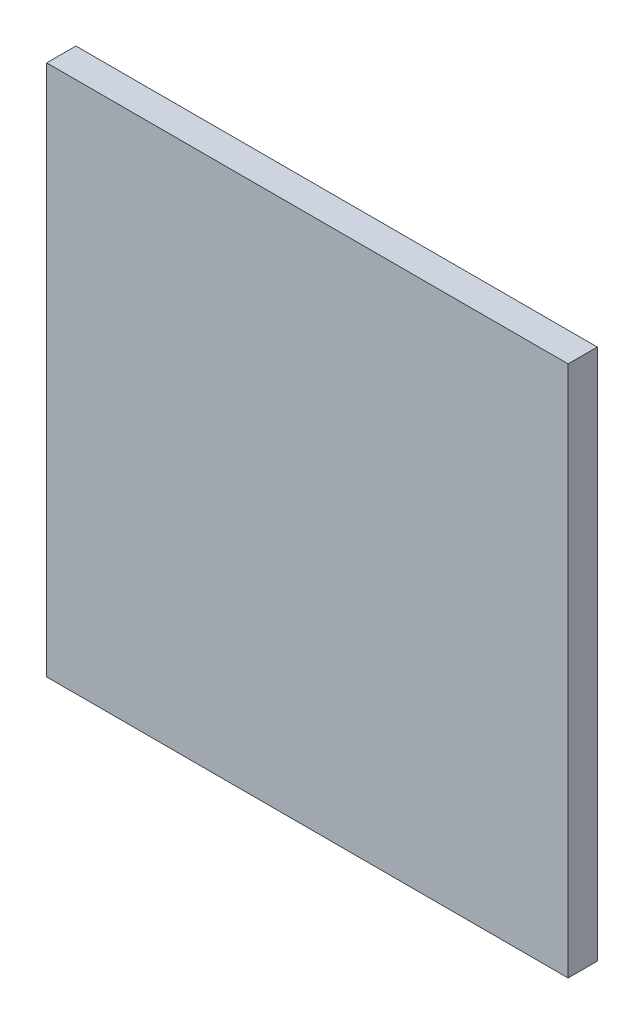
ISO-10303-21;
HEADER;
FILE_DESCRIPTION(('STEP AP214'),'2;1');
FILE_NAME('part.step','',(''),(''),'','','');
FILE_SCHEMA(('AUTOMOTIVE_DESIGN { 1 0 10303 214 1 1 1 1 }'));
ENDSEC;
DATA;
#1=APPLICATION_CONTEXT('core data for automotive mechanical design processes');
#2=APPLICATION_PROTOCOL_DEFINITION('international standard','automotive_design',2000,#1);
#3=PRODUCT_CONTEXT('',#1,'mechanical');
#4=PRODUCT('Part','Part','',(#3));
#5=PRODUCT_RELATED_PRODUCT_CATEGORY('part','',(#4));
#6=PRODUCT_DEFINITION_FORMATION('','',#4);
#7=PRODUCT_DEFINITION_CONTEXT('part definition',#1,'design');
#8=PRODUCT_DEFINITION('design','',#6,#7);
#9=PRODUCT_DEFINITION_SHAPE('','',#8);
#10=(LENGTH_UNIT() NAMED_UNIT(*) SI_UNIT(.MILLI.,.METRE.));
#11=(NAMED_UNIT(*) PLANE_ANGLE_UNIT() SI_UNIT($,.RADIAN.));
#12=(NAMED_UNIT(*) SI_UNIT($,.STERADIAN.) SOLID_ANGLE_UNIT());
#13=UNCERTAINTY_MEASURE_WITH_UNIT(LENGTH_MEASURE(1.E-05),#10,'distance_accuracy_value','');
#14=(GEOMETRIC_REPRESENTATION_CONTEXT(3) GLOBAL_UNCERTAINTY_ASSIGNED_CONTEXT((#13)) GLOBAL_UNIT_ASSIGNED_CONTEXT((#10,
#11,#12)) REPRESENTATION_CONTEXT('',''));
#15=CARTESIAN_POINT('',(0.,0.,0.));
#16=DIRECTION('',(0.,0.,1.));
#17=DIRECTION('',(1.,0.,0.));
#18=AXIS2_PLACEMENT_3D('',#15,#16,#17);
#19=CARTESIAN_POINT('',(0.,0.,-28.));
#20=DIRECTION('',(0.,0.,-1.));
#21=DIRECTION('',(-1.,0.,0.));
#22=AXIS2_PLACEMENT_3D('',#19,#20,#21);
#23=PLANE('',#22);
#24=CARTESIAN_POINT('',(-91.,245.5,-28.));
#25=DIRECTION('',(0.,0.,-1.));
#26=DIRECTION('',(-1.,0.,0.));
#27=AXIS2_PLACEMENT_3D('',#24,#25,#26);
#28=CIRCLE('',#27,3.99999999999999);
#29=CARTESIAN_POINT('',(-95.,245.5,-28.));
#30=VERTEX_POINT('',#29);
#31=EDGE_CURVE('E182',#30,#30,#28,.F.);
#32=ORIENTED_EDGE('',*,*,#31,.T.);
#33=EDGE_LOOP('',(#32));
#34=FACE_BOUND('',#33,.T.);
#35=CARTESIAN_POINT('',(91.,245.5,-28.));
#36=DIRECTION('',(0.,0.,-1.));
#37=DIRECTION('',(-1.,0.,0.));
#38=AXIS2_PLACEMENT_3D('',#35,#36,#37);
#39=CIRCLE('',#38,3.99999999999999);
#40=CARTESIAN_POINT('',(87.,245.5,-28.));
#41=VERTEX_POINT('',#40);
#42=EDGE_CURVE('E175',#41,#41,#39,.F.);
#43=ORIENTED_EDGE('',*,*,#42,.T.);
#44=EDGE_LOOP('',(#43));
#45=FACE_BOUND('',#44,.T.);
#46=CARTESIAN_POINT('',(-182.,245.5,-28.));
#47=DIRECTION('',(0.,0.,-1.));
#48=DIRECTION('',(-1.,0.,0.));
#49=AXIS2_PLACEMENT_3D('',#46,#47,#48);
#50=CIRCLE('',#49,3.99999999999999);
#51=CARTESIAN_POINT('',(-186.,245.5,-28.));
#52=VERTEX_POINT('',#51);
#53=EDGE_CURVE('E167',#52,#52,#50,.F.);
#54=ORIENTED_EDGE('',*,*,#53,.T.);
#55=EDGE_LOOP('',(#54));
#56=FACE_BOUND('',#55,.T.);
#57=CARTESIAN_POINT('',(240.5,-106.,-28.));
#58=DIRECTION('',(0.,0.,-1.));
#59=DIRECTION('',(-1.,0.,0.));
#60=AXIS2_PLACEMENT_3D('',#57,#58,#59);
#61=CIRCLE('',#60,3.99999999999999);
#62=CARTESIAN_POINT('',(236.5,-106.,-28.));
#63=VERTEX_POINT('',#62);
#64=EDGE_CURVE('E159',#63,#63,#61,.F.);
#65=ORIENTED_EDGE('',*,*,#64,.T.);
#66=EDGE_LOOP('',(#65));
#67=FACE_BOUND('',#66,.T.);
#68=CARTESIAN_POINT('',(240.5,-27.,-28.));
#69=DIRECTION('',(0.,0.,-1.));
#70=DIRECTION('',(-1.,0.,0.));
#71=AXIS2_PLACEMENT_3D('',#68,#69,#70);
#72=CIRCLE('',#71,3.99999999999999);
#73=CARTESIAN_POINT('',(236.5,-27.,-28.));
#74=VERTEX_POINT('',#73);
#75=EDGE_CURVE('E151',#74,#74,#72,.F.);
#76=ORIENTED_EDGE('',*,*,#75,.T.);
#77=EDGE_LOOP('',(#76));
#78=FACE_BOUND('',#77,.T.);
#79=CARTESIAN_POINT('',(240.5,52.,-28.));
#80=DIRECTION('',(0.,0.,-1.));
#81=DIRECTION('',(-1.,0.,0.));
#82=AXIS2_PLACEMENT_3D('',#79,#80,#81);
#83=CIRCLE('',#82,3.99999999999999);
#84=CARTESIAN_POINT('',(236.5,52.,-28.));
#85=VERTEX_POINT('',#84);
#86=EDGE_CURVE('E143',#85,#85,#83,.F.);
#87=ORIENTED_EDGE('',*,*,#86,.T.);
#88=EDGE_LOOP('',(#87));
#89=FACE_BOUND('',#88,.T.);
#90=CARTESIAN_POINT('',(240.5,131.,-28.));
#91=DIRECTION('',(0.,0.,-1.));
#92=DIRECTION('',(-1.,0.,0.));
#93=AXIS2_PLACEMENT_3D('',#90,#91,#92);
#94=CIRCLE('',#93,3.99999999999999);
#95=CARTESIAN_POINT('',(236.5,131.,-28.));
#96=VERTEX_POINT('',#95);
#97=EDGE_CURVE('E135',#96,#96,#94,.F.);
#98=ORIENTED_EDGE('',*,*,#97,.T.);
#99=EDGE_LOOP('',(#98));
#100=FACE_BOUND('',#99,.T.);
#101=CARTESIAN_POINT('',(182.,245.5,-28.));
#102=DIRECTION('',(0.,0.,-1.));
#103=DIRECTION('',(-1.,0.,0.));
#104=AXIS2_PLACEMENT_3D('',#101,#102,#103);
#105=CIRCLE('',#104,3.99999999999999);
#106=CARTESIAN_POINT('',(178.,245.5,-28.));
#107=VERTEX_POINT('',#106);
#108=EDGE_CURVE('E127',#107,#107,#105,.F.);
#109=ORIENTED_EDGE('',*,*,#108,.T.);
#110=EDGE_LOOP('',(#109));
#111=FACE_BOUND('',#110,.T.);
#112=DIRECTION('',(0.,-1.,0.));
#113=VECTOR('',#112,1.);
#114=CARTESIAN_POINT('',(-250.,-255.,-28.));
#115=LINE('',#114,#113);
#116=CARTESIAN_POINT('',(-250.,255.,-28.));
#117=VERTEX_POINT('',#116);
#118=CARTESIAN_POINT('',(-250.,-255.,-28.));
#119=VERTEX_POINT('',#118);
#120=EDGE_CURVE('E106',#117,#119,#115,.T.);
#121=ORIENTED_EDGE('',*,*,#120,.F.);
#122=DIRECTION('',(-1.,0.,0.));
#123=VECTOR('',#122,1.);
#124=CARTESIAN_POINT('',(-250.,255.,-28.));
#125=LINE('',#124,#123);
#126=CARTESIAN_POINT('',(250.,255.,-28.));
#127=VERTEX_POINT('',#126);
#128=EDGE_CURVE('E103',#127,#117,#125,.T.);
#129=ORIENTED_EDGE('',*,*,#128,.F.);
#130=DIRECTION('',(0.,1.,0.));
#131=VECTOR('',#130,1.);
#132=CARTESIAN_POINT('',(250.,-255.,-28.));
#133=LINE('',#132,#131);
#134=CARTESIAN_POINT('',(250.,-255.,-28.));
#135=VERTEX_POINT('',#134);
#136=EDGE_CURVE('E95',#135,#127,#133,.T.);
#137=ORIENTED_EDGE('',*,*,#136,.F.);
#138=DIRECTION('',(1.,0.,0.));
#139=VECTOR('',#138,1.);
#140=CARTESIAN_POINT('',(-250.,-255.,-28.));
#141=LINE('',#140,#139);
#142=EDGE_CURVE('E102',#119,#135,#141,.T.);
#143=ORIENTED_EDGE('',*,*,#142,.F.);
#144=EDGE_LOOP('',(#121,#129,#137,#143));
#145=FACE_BOUND('',#144,.T.);
#146=CARTESIAN_POINT('',(240.5,210.,-28.));
#147=DIRECTION('',(0.,0.,-1.));
#148=DIRECTION('',(-1.,0.,0.));
#149=AXIS2_PLACEMENT_3D('',#146,#147,#148);
#150=CIRCLE('',#149,3.99999999999999);
#151=CARTESIAN_POINT('',(236.5,210.,-28.));
#152=VERTEX_POINT('',#151);
#153=EDGE_CURVE('E117',#152,#152,#150,.F.);
#154=ORIENTED_EDGE('',*,*,#153,.T.);
#155=EDGE_LOOP('',(#154));
#156=FACE_BOUND('',#155,.T.);
#157=CARTESIAN_POINT('',(-240.5,210.,-28.));
#158=DIRECTION('',(0.,0.,-1.));
#159=DIRECTION('',(-1.,0.,0.));
#160=AXIS2_PLACEMENT_3D('',#157,#158,#159);
#161=CIRCLE('',#160,3.99999999999999);
#162=CARTESIAN_POINT('',(-244.5,210.,-28.));
#163=VERTEX_POINT('',#162);
#164=EDGE_CURVE('E131',#163,#163,#161,.F.);
#165=ORIENTED_EDGE('',*,*,#164,.T.);
#166=EDGE_LOOP('',(#165));
#167=FACE_BOUND('',#166,.T.);
#168=CARTESIAN_POINT('',(-240.5,131.,-28.));
#169=DIRECTION('',(0.,0.,-1.));
#170=DIRECTION('',(-1.,0.,0.));
#171=AXIS2_PLACEMENT_3D('',#168,#169,#170);
#172=CIRCLE('',#171,3.99999999999999);
#173=CARTESIAN_POINT('',(-244.5,131.,-28.));
#174=VERTEX_POINT('',#173);
#175=EDGE_CURVE('E139',#174,#174,#172,.F.);
#176=ORIENTED_EDGE('',*,*,#175,.T.);
#177=EDGE_LOOP('',(#176));
#178=FACE_BOUND('',#177,.T.);
#179=CARTESIAN_POINT('',(-240.5,52.,-28.));
#180=DIRECTION('',(0.,0.,-1.));
#181=DIRECTION('',(-1.,0.,0.));
#182=AXIS2_PLACEMENT_3D('',#179,#180,#181);
#183=CIRCLE('',#182,3.99999999999999);
#184=CARTESIAN_POINT('',(-244.5,52.,-28.));
#185=VERTEX_POINT('',#184);
#186=EDGE_CURVE('E147',#185,#185,#183,.F.);
#187=ORIENTED_EDGE('',*,*,#186,.T.);
#188=EDGE_LOOP('',(#187));
#189=FACE_BOUND('',#188,.T.);
#190=CARTESIAN_POINT('',(-240.5,-27.,-28.));
#191=DIRECTION('',(0.,0.,-1.));
#192=DIRECTION('',(-1.,0.,0.));
#193=AXIS2_PLACEMENT_3D('',#190,#191,#192);
#194=CIRCLE('',#193,3.99999999999999);
#195=CARTESIAN_POINT('',(-244.5,-27.,-28.));
#196=VERTEX_POINT('',#195);
#197=EDGE_CURVE('E155',#196,#196,#194,.F.);
#198=ORIENTED_EDGE('',*,*,#197,.T.);
#199=EDGE_LOOP('',(#198));
#200=FACE_BOUND('',#199,.T.);
#201=CARTESIAN_POINT('',(-240.5,-106.,-28.));
#202=DIRECTION('',(0.,0.,-1.));
#203=DIRECTION('',(-1.,0.,0.));
#204=AXIS2_PLACEMENT_3D('',#201,#202,#203);
#205=CIRCLE('',#204,3.99999999999999);
#206=CARTESIAN_POINT('',(-244.5,-106.,-28.));
#207=VERTEX_POINT('',#206);
#208=EDGE_CURVE('E163',#207,#207,#205,.F.);
#209=ORIENTED_EDGE('',*,*,#208,.T.);
#210=EDGE_LOOP('',(#209));
#211=FACE_BOUND('',#210,.T.);
#212=CARTESIAN_POINT('',(240.5,-185.,-28.));
#213=DIRECTION('',(0.,0.,-1.));
#214=DIRECTION('',(-1.,0.,0.));
#215=AXIS2_PLACEMENT_3D('',#212,#213,#214);
#216=CIRCLE('',#215,3.99999999999999);
#217=CARTESIAN_POINT('',(236.5,-185.,-28.));
#218=VERTEX_POINT('',#217);
#219=EDGE_CURVE('E171',#218,#218,#216,.F.);
#220=ORIENTED_EDGE('',*,*,#219,.T.);
#221=EDGE_LOOP('',(#220));
#222=FACE_BOUND('',#221,.T.);
#223=CARTESIAN_POINT('',(0.,245.5,-28.));
#224=DIRECTION('',(0.,0.,-1.));
#225=DIRECTION('',(-1.,0.,0.));
#226=AXIS2_PLACEMENT_3D('',#223,#224,#225);
#227=CIRCLE('',#226,4.00000000000001);
#228=CARTESIAN_POINT('',(-4.00000000000001,245.5,-28.));
#229=VERTEX_POINT('',#228);
#230=EDGE_CURVE('E179',#229,#229,#227,.F.);
#231=ORIENTED_EDGE('',*,*,#230,.T.);
#232=EDGE_LOOP('',(#231));
#233=FACE_BOUND('',#232,.T.);
#234=CARTESIAN_POINT('',(-240.5,-185.,-28.));
#235=DIRECTION('',(0.,0.,-1.));
#236=DIRECTION('',(-1.,0.,0.));
#237=AXIS2_PLACEMENT_3D('',#234,#235,#236);
#238=CIRCLE('',#237,3.99999999999999);
#239=CARTESIAN_POINT('',(-244.5,-185.,-28.));
#240=VERTEX_POINT('',#239);
#241=EDGE_CURVE('E49',#240,#240,#238,.F.);
#242=ORIENTED_EDGE('',*,*,#241,.T.);
#243=EDGE_LOOP('',(#242));
#244=FACE_BOUND('',#243,.T.);
#245=ADVANCED_FACE('F45',(#34,#45,#56,#67,#78,#89,#100,#111,#145,#156,#167,#178,#189,#200,#211,
#222,#233,#244),#23,.T.);
#246=CARTESIAN_POINT('',(-250.,-255.,-28.));
#247=DIRECTION('',(-1.,0.,0.));
#248=DIRECTION('',(0.,0.,1.));
#249=AXIS2_PLACEMENT_3D('',#246,#247,#248);
#250=PLANE('',#249);
#251=DIRECTION('',(0.,-1.,0.));
#252=VECTOR('',#251,1.);
#253=CARTESIAN_POINT('',(-250.,-255.,0.));
#254=LINE('',#253,#252);
#255=CARTESIAN_POINT('',(-250.,255.,0.));
#256=VERTEX_POINT('',#255);
#257=CARTESIAN_POINT('',(-250.,-255.,0.));
#258=VERTEX_POINT('',#257);
#259=EDGE_CURVE('E113',#256,#258,#254,.T.);
#260=ORIENTED_EDGE('',*,*,#259,.F.);
#261=DIRECTION('',(0.,0.,1.));
#262=VECTOR('',#261,1.);
#263=CARTESIAN_POINT('',(-250.,255.,-28.));
#264=LINE('',#263,#262);
#265=EDGE_CURVE('E13',#117,#256,#264,.T.);
#266=ORIENTED_EDGE('',*,*,#265,.F.);
#267=ORIENTED_EDGE('',*,*,#120,.T.);
#268=DIRECTION('',(0.,0.,1.));
#269=VECTOR('',#268,1.);
#270=CARTESIAN_POINT('',(-250.,-255.,-28.));
#271=LINE('',#270,#269);
#272=EDGE_CURVE('E89',#119,#258,#271,.T.);
#273=ORIENTED_EDGE('',*,*,#272,.T.);
#274=EDGE_LOOP('',(#260,#266,#267,#273));
#275=FACE_BOUND('',#274,.T.);
#276=ADVANCED_FACE('F47',(#275),#250,.T.);
#277=CARTESIAN_POINT('',(-250.,255.,-28.));
#278=DIRECTION('',(0.,1.,0.));
#279=DIRECTION('',(0.,0.,1.));
#280=AXIS2_PLACEMENT_3D('',#277,#278,#279);
#281=PLANE('',#280);
#282=DIRECTION('',(-1.,0.,0.));
#283=VECTOR('',#282,1.);
#284=CARTESIAN_POINT('',(-250.,255.,0.));
#285=LINE('',#284,#283);
#286=CARTESIAN_POINT('',(250.,255.,0.));
#287=VERTEX_POINT('',#286);
#288=EDGE_CURVE('E108',#287,#256,#285,.T.);
#289=ORIENTED_EDGE('',*,*,#288,.F.);
#290=DIRECTION('',(0.,0.,1.));
#291=VECTOR('',#290,1.);
#292=CARTESIAN_POINT('',(250.,255.,-28.));
#293=LINE('',#292,#291);
#294=EDGE_CURVE('E55',#127,#287,#293,.T.);
#295=ORIENTED_EDGE('',*,*,#294,.F.);
#296=ORIENTED_EDGE('',*,*,#128,.T.);
#297=ORIENTED_EDGE('',*,*,#265,.T.);
#298=EDGE_LOOP('',(#289,#295,#296,#297));
#299=FACE_BOUND('',#298,.T.);
#300=ADVANCED_FACE('F246',(#299),#281,.T.);
#301=CARTESIAN_POINT('',(250.,-255.,-28.));
#302=DIRECTION('',(1.,0.,0.));
#303=DIRECTION('',(0.,0.,-1.));
#304=AXIS2_PLACEMENT_3D('',#301,#302,#303);
#305=PLANE('',#304);
#306=DIRECTION('',(0.,1.,0.));
#307=VECTOR('',#306,1.);
#308=CARTESIAN_POINT('',(250.,-255.,0.));
#309=LINE('',#308,#307);
#310=CARTESIAN_POINT('',(250.,-255.,0.));
#311=VERTEX_POINT('',#310);
#312=EDGE_CURVE('E97',#311,#287,#309,.T.);
#313=ORIENTED_EDGE('',*,*,#312,.F.);
#314=DIRECTION('',(0.,0.,1.));
#315=VECTOR('',#314,1.);
#316=CARTESIAN_POINT('',(250.,-255.,-28.));
#317=LINE('',#316,#315);
#318=EDGE_CURVE('E92',#135,#311,#317,.T.);
#319=ORIENTED_EDGE('',*,*,#318,.F.);
#320=ORIENTED_EDGE('',*,*,#136,.T.);
#321=ORIENTED_EDGE('',*,*,#294,.T.);
#322=EDGE_LOOP('',(#313,#319,#320,#321));
#323=FACE_BOUND('',#322,.T.);
#324=ADVANCED_FACE('F94',(#323),#305,.T.);
#325=CARTESIAN_POINT('',(-250.,-255.,-28.));
#326=DIRECTION('',(0.,-1.,0.));
#327=DIRECTION('',(0.,0.,-1.));
#328=AXIS2_PLACEMENT_3D('',#325,#326,#327);
#329=PLANE('',#328);
#330=DIRECTION('',(1.,0.,0.));
#331=VECTOR('',#330,1.);
#332=CARTESIAN_POINT('',(-250.,-255.,0.));
#333=LINE('',#332,#331);
#334=EDGE_CURVE('E116',#258,#311,#333,.T.);
#335=ORIENTED_EDGE('',*,*,#334,.F.);
#336=ORIENTED_EDGE('',*,*,#272,.F.);
#337=ORIENTED_EDGE('',*,*,#142,.T.);
#338=ORIENTED_EDGE('',*,*,#318,.T.);
#339=EDGE_LOOP('',(#335,#336,#337,#338));
#340=FACE_BOUND('',#339,.T.);
#341=ADVANCED_FACE('F105',(#340),#329,.T.);
#342=CARTESIAN_POINT('',(0.,0.,0.));
#343=DIRECTION('',(0.,0.,-1.));
#344=DIRECTION('',(-1.,0.,0.));
#345=AXIS2_PLACEMENT_3D('',#342,#343,#344);
#346=PLANE('',#345);
#347=ORIENTED_EDGE('',*,*,#259,.T.);
#348=ORIENTED_EDGE('',*,*,#334,.T.);
#349=ORIENTED_EDGE('',*,*,#312,.T.);
#350=ORIENTED_EDGE('',*,*,#288,.T.);
#351=EDGE_LOOP('',(#347,#348,#349,#350));
#352=FACE_BOUND('',#351,.T.);
#353=ADVANCED_FACE('F229',(#352),#346,.F.);
#354=CARTESIAN_POINT('',(240.5,210.,-53.));
#355=DIRECTION('',(0.,0.,1.));
#356=DIRECTION('',(1.,0.,0.));
#357=AXIS2_PLACEMENT_3D('',#354,#355,#356);
#358=CYLINDRICAL_SURFACE('',#357,3.99999999999999);
#359=ORIENTED_EDGE('',*,*,#153,.F.);
#360=EDGE_LOOP('',(#359));
#361=FACE_BOUND('',#360,.T.);
#362=CARTESIAN_POINT('',(240.5,210.,-15.));
#363=DIRECTION('',(0.,0.,-1.));
#364=DIRECTION('',(-1.,0.,0.));
#365=AXIS2_PLACEMENT_3D('',#362,#363,#364);
#366=CIRCLE('',#365,3.99999999999999);
#367=CARTESIAN_POINT('',(236.5,210.,-15.));
#368=VERTEX_POINT('',#367);
#369=EDGE_CURVE('E126',#368,#368,#366,.T.);
#370=ORIENTED_EDGE('',*,*,#369,.F.);
#371=EDGE_LOOP('',(#370));
#372=FACE_BOUND('',#371,.T.);
#373=ADVANCED_FACE('F227',(#361,#372),#358,.F.);
#374=CARTESIAN_POINT('',(240.5,210.,-15.));
#375=DIRECTION('',(0.,0.,-1.));
#376=DIRECTION('',(-1.,0.,0.));
#377=AXIS2_PLACEMENT_3D('',#374,#375,#376);
#378=PLANE('',#377);
#379=ORIENTED_EDGE('',*,*,#369,.T.);
#380=EDGE_LOOP('',(#379));
#381=FACE_BOUND('',#380,.T.);
#382=ADVANCED_FACE('F225',(#381),#378,.T.);
#383=CARTESIAN_POINT('',(182.,245.5,-53.));
#384=DIRECTION('',(0.,0.,1.));
#385=DIRECTION('',(1.,0.,0.));
#386=AXIS2_PLACEMENT_3D('',#383,#384,#385);
#387=CYLINDRICAL_SURFACE('',#386,3.99999999999999);
#388=ORIENTED_EDGE('',*,*,#108,.F.);
#389=EDGE_LOOP('',(#388));
#390=FACE_BOUND('',#389,.T.);
#391=CARTESIAN_POINT('',(182.,245.5,-15.));
#392=DIRECTION('',(0.,0.,-1.));
#393=DIRECTION('',(-1.,0.,0.));
#394=AXIS2_PLACEMENT_3D('',#391,#392,#393);
#395=CIRCLE('',#394,3.99999999999999);
#396=CARTESIAN_POINT('',(178.,245.5,-15.));
#397=VERTEX_POINT('',#396);
#398=EDGE_CURVE('E130',#397,#397,#395,.T.);
#399=ORIENTED_EDGE('',*,*,#398,.F.);
#400=EDGE_LOOP('',(#399));
#401=FACE_BOUND('',#400,.T.);
#402=ADVANCED_FACE('F236',(#390,#401),#387,.F.);
#403=CARTESIAN_POINT('',(182.,245.5,-15.));
#404=DIRECTION('',(0.,0.,-1.));
#405=DIRECTION('',(-1.,0.,0.));
#406=AXIS2_PLACEMENT_3D('',#403,#404,#405);
#407=PLANE('',#406);
#408=ORIENTED_EDGE('',*,*,#398,.T.);
#409=EDGE_LOOP('',(#408));
#410=FACE_BOUND('',#409,.T.);
#411=ADVANCED_FACE('F284',(#410),#407,.T.);
#412=CARTESIAN_POINT('',(-240.5,210.,-53.));
#413=DIRECTION('',(0.,0.,1.));
#414=DIRECTION('',(1.,0.,0.));
#415=AXIS2_PLACEMENT_3D('',#412,#413,#414);
#416=CYLINDRICAL_SURFACE('',#415,3.99999999999999);
#417=ORIENTED_EDGE('',*,*,#164,.F.);
#418=EDGE_LOOP('',(#417));
#419=FACE_BOUND('',#418,.T.);
#420=CARTESIAN_POINT('',(-240.5,210.,-15.));
#421=DIRECTION('',(0.,0.,-1.));
#422=DIRECTION('',(-1.,0.,0.));
#423=AXIS2_PLACEMENT_3D('',#420,#421,#422);
#424=CIRCLE('',#423,3.99999999999999);
#425=CARTESIAN_POINT('',(-244.5,210.,-15.));
#426=VERTEX_POINT('',#425);
#427=EDGE_CURVE('E134',#426,#426,#424,.T.);
#428=ORIENTED_EDGE('',*,*,#427,.F.);
#429=EDGE_LOOP('',(#428));
#430=FACE_BOUND('',#429,.T.);
#431=ADVANCED_FACE('F294',(#419,#430),#416,.F.);
#432=CARTESIAN_POINT('',(-240.5,210.,-15.));
#433=DIRECTION('',(0.,0.,-1.));
#434=DIRECTION('',(-1.,0.,0.));
#435=AXIS2_PLACEMENT_3D('',#432,#433,#434);
#436=PLANE('',#435);
#437=ORIENTED_EDGE('',*,*,#427,.T.);
#438=EDGE_LOOP('',(#437));
#439=FACE_BOUND('',#438,.T.);
#440=ADVANCED_FACE('F304',(#439),#436,.T.);
#441=CARTESIAN_POINT('',(240.5,131.,-53.));
#442=DIRECTION('',(0.,0.,1.));
#443=DIRECTION('',(1.,0.,0.));
#444=AXIS2_PLACEMENT_3D('',#441,#442,#443);
#445=CYLINDRICAL_SURFACE('',#444,3.99999999999999);
#446=ORIENTED_EDGE('',*,*,#97,.F.);
#447=EDGE_LOOP('',(#446));
#448=FACE_BOUND('',#447,.T.);
#449=CARTESIAN_POINT('',(240.5,131.,-15.));
#450=DIRECTION('',(0.,0.,-1.));
#451=DIRECTION('',(-1.,0.,0.));
#452=AXIS2_PLACEMENT_3D('',#449,#450,#451);
#453=CIRCLE('',#452,3.99999999999999);
#454=CARTESIAN_POINT('',(236.5,131.,-15.));
#455=VERTEX_POINT('',#454);
#456=EDGE_CURVE('E138',#455,#455,#453,.T.);
#457=ORIENTED_EDGE('',*,*,#456,.F.);
#458=EDGE_LOOP('',(#457));
#459=FACE_BOUND('',#458,.T.);
#460=ADVANCED_FACE('F314',(#448,#459),#445,.F.);
#461=CARTESIAN_POINT('',(240.5,131.,-15.));
#462=DIRECTION('',(0.,0.,-1.));
#463=DIRECTION('',(-1.,0.,0.));
#464=AXIS2_PLACEMENT_3D('',#461,#462,#463);
#465=PLANE('',#464);
#466=ORIENTED_EDGE('',*,*,#456,.T.);
#467=EDGE_LOOP('',(#466));
#468=FACE_BOUND('',#467,.T.);
#469=ADVANCED_FACE('F324',(#468),#465,.T.);
#470=CARTESIAN_POINT('',(-240.5,131.,-53.));
#471=DIRECTION('',(0.,0.,1.));
#472=DIRECTION('',(1.,0.,0.));
#473=AXIS2_PLACEMENT_3D('',#470,#471,#472);
#474=CYLINDRICAL_SURFACE('',#473,3.99999999999999);
#475=ORIENTED_EDGE('',*,*,#175,.F.);
#476=EDGE_LOOP('',(#475));
#477=FACE_BOUND('',#476,.T.);
#478=CARTESIAN_POINT('',(-240.5,131.,-15.));
#479=DIRECTION('',(0.,0.,-1.));
#480=DIRECTION('',(-1.,0.,0.));
#481=AXIS2_PLACEMENT_3D('',#478,#479,#480);
#482=CIRCLE('',#481,3.99999999999999);
#483=CARTESIAN_POINT('',(-244.5,131.,-15.));
#484=VERTEX_POINT('',#483);
#485=EDGE_CURVE('E142',#484,#484,#482,.T.);
#486=ORIENTED_EDGE('',*,*,#485,.F.);
#487=EDGE_LOOP('',(#486));
#488=FACE_BOUND('',#487,.T.);
#489=ADVANCED_FACE('F334',(#477,#488),#474,.F.);
#490=CARTESIAN_POINT('',(-240.5,131.,-15.));
#491=DIRECTION('',(0.,0.,-1.));
#492=DIRECTION('',(-1.,0.,0.));
#493=AXIS2_PLACEMENT_3D('',#490,#491,#492);
#494=PLANE('',#493);
#495=ORIENTED_EDGE('',*,*,#485,.T.);
#496=EDGE_LOOP('',(#495));
#497=FACE_BOUND('',#496,.T.);
#498=ADVANCED_FACE('F344',(#497),#494,.T.);
#499=CARTESIAN_POINT('',(240.5,52.,-53.));
#500=DIRECTION('',(0.,0.,1.));
#501=DIRECTION('',(1.,0.,0.));
#502=AXIS2_PLACEMENT_3D('',#499,#500,#501);
#503=CYLINDRICAL_SURFACE('',#502,3.99999999999999);
#504=ORIENTED_EDGE('',*,*,#86,.F.);
#505=EDGE_LOOP('',(#504));
#506=FACE_BOUND('',#505,.T.);
#507=CARTESIAN_POINT('',(240.5,52.,-15.));
#508=DIRECTION('',(0.,0.,-1.));
#509=DIRECTION('',(-1.,0.,0.));
#510=AXIS2_PLACEMENT_3D('',#507,#508,#509);
#511=CIRCLE('',#510,3.99999999999999);
#512=CARTESIAN_POINT('',(236.5,52.,-15.));
#513=VERTEX_POINT('',#512);
#514=EDGE_CURVE('E146',#513,#513,#511,.T.);
#515=ORIENTED_EDGE('',*,*,#514,.F.);
#516=EDGE_LOOP('',(#515));
#517=FACE_BOUND('',#516,.T.);
#518=ADVANCED_FACE('F354',(#506,#517),#503,.F.);
#519=CARTESIAN_POINT('',(240.5,52.,-15.));
#520=DIRECTION('',(0.,0.,-1.));
#521=DIRECTION('',(-1.,0.,0.));
#522=AXIS2_PLACEMENT_3D('',#519,#520,#521);
#523=PLANE('',#522);
#524=ORIENTED_EDGE('',*,*,#514,.T.);
#525=EDGE_LOOP('',(#524));
#526=FACE_BOUND('',#525,.T.);
#527=ADVANCED_FACE('F364',(#526),#523,.T.);
#528=CARTESIAN_POINT('',(-240.5,52.,-53.));
#529=DIRECTION('',(0.,0.,1.));
#530=DIRECTION('',(1.,0.,0.));
#531=AXIS2_PLACEMENT_3D('',#528,#529,#530);
#532=CYLINDRICAL_SURFACE('',#531,3.99999999999999);
#533=ORIENTED_EDGE('',*,*,#186,.F.);
#534=EDGE_LOOP('',(#533));
#535=FACE_BOUND('',#534,.T.);
#536=CARTESIAN_POINT('',(-240.5,52.,-15.));
#537=DIRECTION('',(0.,0.,-1.));
#538=DIRECTION('',(-1.,0.,0.));
#539=AXIS2_PLACEMENT_3D('',#536,#537,#538);
#540=CIRCLE('',#539,3.99999999999999);
#541=CARTESIAN_POINT('',(-244.5,52.,-15.));
#542=VERTEX_POINT('',#541);
#543=EDGE_CURVE('E150',#542,#542,#540,.T.);
#544=ORIENTED_EDGE('',*,*,#543,.F.);
#545=EDGE_LOOP('',(#544));
#546=FACE_BOUND('',#545,.T.);
#547=ADVANCED_FACE('F374',(#535,#546),#532,.F.);
#548=CARTESIAN_POINT('',(-240.5,52.,-15.));
#549=DIRECTION('',(0.,0.,-1.));
#550=DIRECTION('',(-1.,0.,0.));
#551=AXIS2_PLACEMENT_3D('',#548,#549,#550);
#552=PLANE('',#551);
#553=ORIENTED_EDGE('',*,*,#543,.T.);
#554=EDGE_LOOP('',(#553));
#555=FACE_BOUND('',#554,.T.);
#556=ADVANCED_FACE('F384',(#555),#552,.T.);
#557=CARTESIAN_POINT('',(240.5,-27.,-53.));
#558=DIRECTION('',(0.,0.,1.));
#559=DIRECTION('',(1.,0.,0.));
#560=AXIS2_PLACEMENT_3D('',#557,#558,#559);
#561=CYLINDRICAL_SURFACE('',#560,3.99999999999999);
#562=ORIENTED_EDGE('',*,*,#75,.F.);
#563=EDGE_LOOP('',(#562));
#564=FACE_BOUND('',#563,.T.);
#565=CARTESIAN_POINT('',(240.5,-27.,-15.));
#566=DIRECTION('',(0.,0.,-1.));
#567=DIRECTION('',(-1.,0.,0.));
#568=AXIS2_PLACEMENT_3D('',#565,#566,#567);
#569=CIRCLE('',#568,3.99999999999999);
#570=CARTESIAN_POINT('',(236.5,-27.,-15.));
#571=VERTEX_POINT('',#570);
#572=EDGE_CURVE('E154',#571,#571,#569,.T.);
#573=ORIENTED_EDGE('',*,*,#572,.F.);
#574=EDGE_LOOP('',(#573));
#575=FACE_BOUND('',#574,.T.);
#576=ADVANCED_FACE('F394',(#564,#575),#561,.F.);
#577=CARTESIAN_POINT('',(240.5,-27.,-15.));
#578=DIRECTION('',(0.,0.,-1.));
#579=DIRECTION('',(-1.,0.,0.));
#580=AXIS2_PLACEMENT_3D('',#577,#578,#579);
#581=PLANE('',#580);
#582=ORIENTED_EDGE('',*,*,#572,.T.);
#583=EDGE_LOOP('',(#582));
#584=FACE_BOUND('',#583,.T.);
#585=ADVANCED_FACE('F404',(#584),#581,.T.);
#586=CARTESIAN_POINT('',(-240.5,-27.,-53.));
#587=DIRECTION('',(0.,0.,1.));
#588=DIRECTION('',(1.,0.,0.));
#589=AXIS2_PLACEMENT_3D('',#586,#587,#588);
#590=CYLINDRICAL_SURFACE('',#589,3.99999999999999);
#591=ORIENTED_EDGE('',*,*,#197,.F.);
#592=EDGE_LOOP('',(#591));
#593=FACE_BOUND('',#592,.T.);
#594=CARTESIAN_POINT('',(-240.5,-27.,-15.));
#595=DIRECTION('',(0.,0.,-1.));
#596=DIRECTION('',(-1.,0.,0.));
#597=AXIS2_PLACEMENT_3D('',#594,#595,#596);
#598=CIRCLE('',#597,3.99999999999999);
#599=CARTESIAN_POINT('',(-244.5,-27.,-15.));
#600=VERTEX_POINT('',#599);
#601=EDGE_CURVE('E158',#600,#600,#598,.T.);
#602=ORIENTED_EDGE('',*,*,#601,.F.);
#603=EDGE_LOOP('',(#602));
#604=FACE_BOUND('',#603,.T.);
#605=ADVANCED_FACE('F414',(#593,#604),#590,.F.);
#606=CARTESIAN_POINT('',(-240.5,-27.,-15.));
#607=DIRECTION('',(0.,0.,-1.));
#608=DIRECTION('',(-1.,0.,0.));
#609=AXIS2_PLACEMENT_3D('',#606,#607,#608);
#610=PLANE('',#609);
#611=ORIENTED_EDGE('',*,*,#601,.T.);
#612=EDGE_LOOP('',(#611));
#613=FACE_BOUND('',#612,.T.);
#614=ADVANCED_FACE('F424',(#613),#610,.T.);
#615=CARTESIAN_POINT('',(240.5,-106.,-53.));
#616=DIRECTION('',(0.,0.,1.));
#617=DIRECTION('',(1.,0.,0.));
#618=AXIS2_PLACEMENT_3D('',#615,#616,#617);
#619=CYLINDRICAL_SURFACE('',#618,3.99999999999999);
#620=ORIENTED_EDGE('',*,*,#64,.F.);
#621=EDGE_LOOP('',(#620));
#622=FACE_BOUND('',#621,.T.);
#623=CARTESIAN_POINT('',(240.5,-106.,-15.));
#624=DIRECTION('',(0.,0.,-1.));
#625=DIRECTION('',(-1.,0.,0.));
#626=AXIS2_PLACEMENT_3D('',#623,#624,#625);
#627=CIRCLE('',#626,3.99999999999999);
#628=CARTESIAN_POINT('',(236.5,-106.,-15.));
#629=VERTEX_POINT('',#628);
#630=EDGE_CURVE('E162',#629,#629,#627,.T.);
#631=ORIENTED_EDGE('',*,*,#630,.F.);
#632=EDGE_LOOP('',(#631));
#633=FACE_BOUND('',#632,.T.);
#634=ADVANCED_FACE('F434',(#622,#633),#619,.F.);
#635=CARTESIAN_POINT('',(240.5,-106.,-15.));
#636=DIRECTION('',(0.,0.,-1.));
#637=DIRECTION('',(-1.,0.,0.));
#638=AXIS2_PLACEMENT_3D('',#635,#636,#637);
#639=PLANE('',#638);
#640=ORIENTED_EDGE('',*,*,#630,.T.);
#641=EDGE_LOOP('',(#640));
#642=FACE_BOUND('',#641,.T.);
#643=ADVANCED_FACE('F444',(#642),#639,.T.);
#644=CARTESIAN_POINT('',(-240.5,-106.,-53.));
#645=DIRECTION('',(0.,0.,1.));
#646=DIRECTION('',(1.,0.,0.));
#647=AXIS2_PLACEMENT_3D('',#644,#645,#646);
#648=CYLINDRICAL_SURFACE('',#647,3.99999999999999);
#649=ORIENTED_EDGE('',*,*,#208,.F.);
#650=EDGE_LOOP('',(#649));
#651=FACE_BOUND('',#650,.T.);
#652=CARTESIAN_POINT('',(-240.5,-106.,-15.));
#653=DIRECTION('',(0.,0.,-1.));
#654=DIRECTION('',(-1.,0.,0.));
#655=AXIS2_PLACEMENT_3D('',#652,#653,#654);
#656=CIRCLE('',#655,3.99999999999999);
#657=CARTESIAN_POINT('',(-244.5,-106.,-15.));
#658=VERTEX_POINT('',#657);
#659=EDGE_CURVE('E166',#658,#658,#656,.T.);
#660=ORIENTED_EDGE('',*,*,#659,.F.);
#661=EDGE_LOOP('',(#660));
#662=FACE_BOUND('',#661,.T.);
#663=ADVANCED_FACE('F454',(#651,#662),#648,.F.);
#664=CARTESIAN_POINT('',(-240.5,-106.,-15.));
#665=DIRECTION('',(0.,0.,-1.));
#666=DIRECTION('',(-1.,0.,0.));
#667=AXIS2_PLACEMENT_3D('',#664,#665,#666);
#668=PLANE('',#667);
#669=ORIENTED_EDGE('',*,*,#659,.T.);
#670=EDGE_LOOP('',(#669));
#671=FACE_BOUND('',#670,.T.);
#672=ADVANCED_FACE('F464',(#671),#668,.T.);
#673=CARTESIAN_POINT('',(-182.,245.5,-53.));
#674=DIRECTION('',(0.,0.,1.));
#675=DIRECTION('',(1.,0.,0.));
#676=AXIS2_PLACEMENT_3D('',#673,#674,#675);
#677=CYLINDRICAL_SURFACE('',#676,3.99999999999999);
#678=ORIENTED_EDGE('',*,*,#53,.F.);
#679=EDGE_LOOP('',(#678));
#680=FACE_BOUND('',#679,.T.);
#681=CARTESIAN_POINT('',(-182.,245.5,-15.));
#682=DIRECTION('',(0.,0.,-1.));
#683=DIRECTION('',(-1.,0.,0.));
#684=AXIS2_PLACEMENT_3D('',#681,#682,#683);
#685=CIRCLE('',#684,3.99999999999999);
#686=CARTESIAN_POINT('',(-186.,245.5,-15.));
#687=VERTEX_POINT('',#686);
#688=EDGE_CURVE('E170',#687,#687,#685,.T.);
#689=ORIENTED_EDGE('',*,*,#688,.F.);
#690=EDGE_LOOP('',(#689));
#691=FACE_BOUND('',#690,.T.);
#692=ADVANCED_FACE('F474',(#680,#691),#677,.F.);
#693=CARTESIAN_POINT('',(-182.,245.5,-15.));
#694=DIRECTION('',(0.,0.,-1.));
#695=DIRECTION('',(-1.,0.,0.));
#696=AXIS2_PLACEMENT_3D('',#693,#694,#695);
#697=PLANE('',#696);
#698=ORIENTED_EDGE('',*,*,#688,.T.);
#699=EDGE_LOOP('',(#698));
#700=FACE_BOUND('',#699,.T.);
#701=ADVANCED_FACE('F484',(#700),#697,.T.);
#702=CARTESIAN_POINT('',(240.5,-185.,-53.));
#703=DIRECTION('',(0.,0.,1.));
#704=DIRECTION('',(1.,0.,0.));
#705=AXIS2_PLACEMENT_3D('',#702,#703,#704);
#706=CYLINDRICAL_SURFACE('',#705,3.99999999999999);
#707=ORIENTED_EDGE('',*,*,#219,.F.);
#708=EDGE_LOOP('',(#707));
#709=FACE_BOUND('',#708,.T.);
#710=CARTESIAN_POINT('',(240.5,-185.,-15.));
#711=DIRECTION('',(0.,0.,-1.));
#712=DIRECTION('',(-1.,0.,0.));
#713=AXIS2_PLACEMENT_3D('',#710,#711,#712);
#714=CIRCLE('',#713,3.99999999999999);
#715=CARTESIAN_POINT('',(236.5,-185.,-15.));
#716=VERTEX_POINT('',#715);
#717=EDGE_CURVE('E174',#716,#716,#714,.T.);
#718=ORIENTED_EDGE('',*,*,#717,.F.);
#719=EDGE_LOOP('',(#718));
#720=FACE_BOUND('',#719,.T.);
#721=ADVANCED_FACE('F494',(#709,#720),#706,.F.);
#722=CARTESIAN_POINT('',(240.5,-185.,-15.));
#723=DIRECTION('',(0.,0.,-1.));
#724=DIRECTION('',(-1.,0.,0.));
#725=AXIS2_PLACEMENT_3D('',#722,#723,#724);
#726=PLANE('',#725);
#727=ORIENTED_EDGE('',*,*,#717,.T.);
#728=EDGE_LOOP('',(#727));
#729=FACE_BOUND('',#728,.T.);
#730=ADVANCED_FACE('F504',(#729),#726,.T.);
#731=CARTESIAN_POINT('',(91.,245.5,-53.));
#732=DIRECTION('',(0.,0.,1.));
#733=DIRECTION('',(1.,0.,0.));
#734=AXIS2_PLACEMENT_3D('',#731,#732,#733);
#735=CYLINDRICAL_SURFACE('',#734,3.99999999999999);
#736=ORIENTED_EDGE('',*,*,#42,.F.);
#737=EDGE_LOOP('',(#736));
#738=FACE_BOUND('',#737,.T.);
#739=CARTESIAN_POINT('',(91.,245.5,-15.));
#740=DIRECTION('',(0.,0.,-1.));
#741=DIRECTION('',(-1.,0.,0.));
#742=AXIS2_PLACEMENT_3D('',#739,#740,#741);
#743=CIRCLE('',#742,3.99999999999999);
#744=CARTESIAN_POINT('',(87.,245.5,-15.));
#745=VERTEX_POINT('',#744);
#746=EDGE_CURVE('E178',#745,#745,#743,.T.);
#747=ORIENTED_EDGE('',*,*,#746,.F.);
#748=EDGE_LOOP('',(#747));
#749=FACE_BOUND('',#748,.T.);
#750=ADVANCED_FACE('F514',(#738,#749),#735,.F.);
#751=CARTESIAN_POINT('',(91.,245.5,-15.));
#752=DIRECTION('',(0.,0.,-1.));
#753=DIRECTION('',(-1.,0.,0.));
#754=AXIS2_PLACEMENT_3D('',#751,#752,#753);
#755=PLANE('',#754);
#756=ORIENTED_EDGE('',*,*,#746,.T.);
#757=EDGE_LOOP('',(#756));
#758=FACE_BOUND('',#757,.T.);
#759=ADVANCED_FACE('F524',(#758),#755,.T.);
#760=CARTESIAN_POINT('',(0.,245.5,-53.));
#761=DIRECTION('',(0.,0.,1.));
#762=DIRECTION('',(1.,0.,0.));
#763=AXIS2_PLACEMENT_3D('',#760,#761,#762);
#764=CYLINDRICAL_SURFACE('',#763,4.00000000000001);
#765=ORIENTED_EDGE('',*,*,#230,.F.);
#766=EDGE_LOOP('',(#765));
#767=FACE_BOUND('',#766,.T.);
#768=CARTESIAN_POINT('',(0.,245.5,-15.));
#769=DIRECTION('',(0.,0.,-1.));
#770=DIRECTION('',(-1.,0.,0.));
#771=AXIS2_PLACEMENT_3D('',#768,#769,#770);
#772=CIRCLE('',#771,4.00000000000001);
#773=CARTESIAN_POINT('',(-4.00000000000001,245.5,-15.));
#774=VERTEX_POINT('',#773);
#775=EDGE_CURVE('E181',#774,#774,#772,.T.);
#776=ORIENTED_EDGE('',*,*,#775,.F.);
#777=EDGE_LOOP('',(#776));
#778=FACE_BOUND('',#777,.T.);
#779=ADVANCED_FACE('F534',(#767,#778),#764,.F.);
#780=CARTESIAN_POINT('',(0.,245.5,-15.));
#781=DIRECTION('',(0.,0.,-1.));
#782=DIRECTION('',(-1.,0.,0.));
#783=AXIS2_PLACEMENT_3D('',#780,#781,#782);
#784=PLANE('',#783);
#785=ORIENTED_EDGE('',*,*,#775,.T.);
#786=EDGE_LOOP('',(#785));
#787=FACE_BOUND('',#786,.T.);
#788=ADVANCED_FACE('F544',(#787),#784,.T.);
#789=CARTESIAN_POINT('',(-91.,245.5,-53.));
#790=DIRECTION('',(0.,0.,1.));
#791=DIRECTION('',(1.,0.,0.));
#792=AXIS2_PLACEMENT_3D('',#789,#790,#791);
#793=CYLINDRICAL_SURFACE('',#792,3.99999999999999);
#794=ORIENTED_EDGE('',*,*,#31,.F.);
#795=EDGE_LOOP('',(#794));
#796=FACE_BOUND('',#795,.T.);
#797=CARTESIAN_POINT('',(-91.,245.5,-15.));
#798=DIRECTION('',(0.,0.,-1.));
#799=DIRECTION('',(-1.,0.,0.));
#800=AXIS2_PLACEMENT_3D('',#797,#798,#799);
#801=CIRCLE('',#800,3.99999999999999);
#802=CARTESIAN_POINT('',(-95.,245.5,-15.));
#803=VERTEX_POINT('',#802);
#804=EDGE_CURVE('E184',#803,#803,#801,.T.);
#805=ORIENTED_EDGE('',*,*,#804,.F.);
#806=EDGE_LOOP('',(#805));
#807=FACE_BOUND('',#806,.T.);
#808=ADVANCED_FACE('F554',(#796,#807),#793,.F.);
#809=CARTESIAN_POINT('',(-91.,245.5,-15.));
#810=DIRECTION('',(0.,0.,-1.));
#811=DIRECTION('',(-1.,0.,0.));
#812=AXIS2_PLACEMENT_3D('',#809,#810,#811);
#813=PLANE('',#812);
#814=ORIENTED_EDGE('',*,*,#804,.T.);
#815=EDGE_LOOP('',(#814));
#816=FACE_BOUND('',#815,.T.);
#817=ADVANCED_FACE('F564',(#816),#813,.T.);
#818=CARTESIAN_POINT('',(-240.5,-185.,-53.));
#819=DIRECTION('',(0.,0.,1.));
#820=DIRECTION('',(1.,0.,0.));
#821=AXIS2_PLACEMENT_3D('',#818,#819,#820);
#822=CYLINDRICAL_SURFACE('',#821,3.99999999999999);
#823=ORIENTED_EDGE('',*,*,#241,.F.);
#824=EDGE_LOOP('',(#823));
#825=FACE_BOUND('',#824,.T.);
#826=CARTESIAN_POINT('',(-240.5,-185.,-15.));
#827=DIRECTION('',(0.,0.,-1.));
#828=DIRECTION('',(-1.,0.,0.));
#829=AXIS2_PLACEMENT_3D('',#826,#827,#828);
#830=CIRCLE('',#829,3.99999999999999);
#831=CARTESIAN_POINT('',(-244.5,-185.,-15.));
#832=VERTEX_POINT('',#831);
#833=EDGE_CURVE('E194',#832,#832,#830,.T.);
#834=ORIENTED_EDGE('',*,*,#833,.F.);
#835=EDGE_LOOP('',(#834));
#836=FACE_BOUND('',#835,.T.);
#837=ADVANCED_FACE('F574',(#825,#836),#822,.F.);
#838=CARTESIAN_POINT('',(-240.5,-185.,-15.));
#839=DIRECTION('',(0.,0.,-1.));
#840=DIRECTION('',(-1.,0.,0.));
#841=AXIS2_PLACEMENT_3D('',#838,#839,#840);
#842=PLANE('',#841);
#843=ORIENTED_EDGE('',*,*,#833,.T.);
#844=EDGE_LOOP('',(#843));
#845=FACE_BOUND('',#844,.T.);
#846=ADVANCED_FACE('F583',(#845),#842,.T.);
#847=CLOSED_SHELL('',(#245,#276,#300,#324,#341,#353,#373,#382,#402,#411,#431,#440,#460,#469,
#489,#498,#518,#527,#547,#556,#576,#585,#605,#614,#634,#643,#663,#672,#692,#701,#721,#730,#750,
#759,#779,#788,#808,#817,#837,#846));
#848=MANIFOLD_SOLID_BREP('B2',#847);
#849=ADVANCED_BREP_SHAPE_REPRESENTATION('',(#18,#848),#14);
#850=SHAPE_DEFINITION_REPRESENTATION(#9,#849);
ENDSEC;
END-ISO-10303-21;
